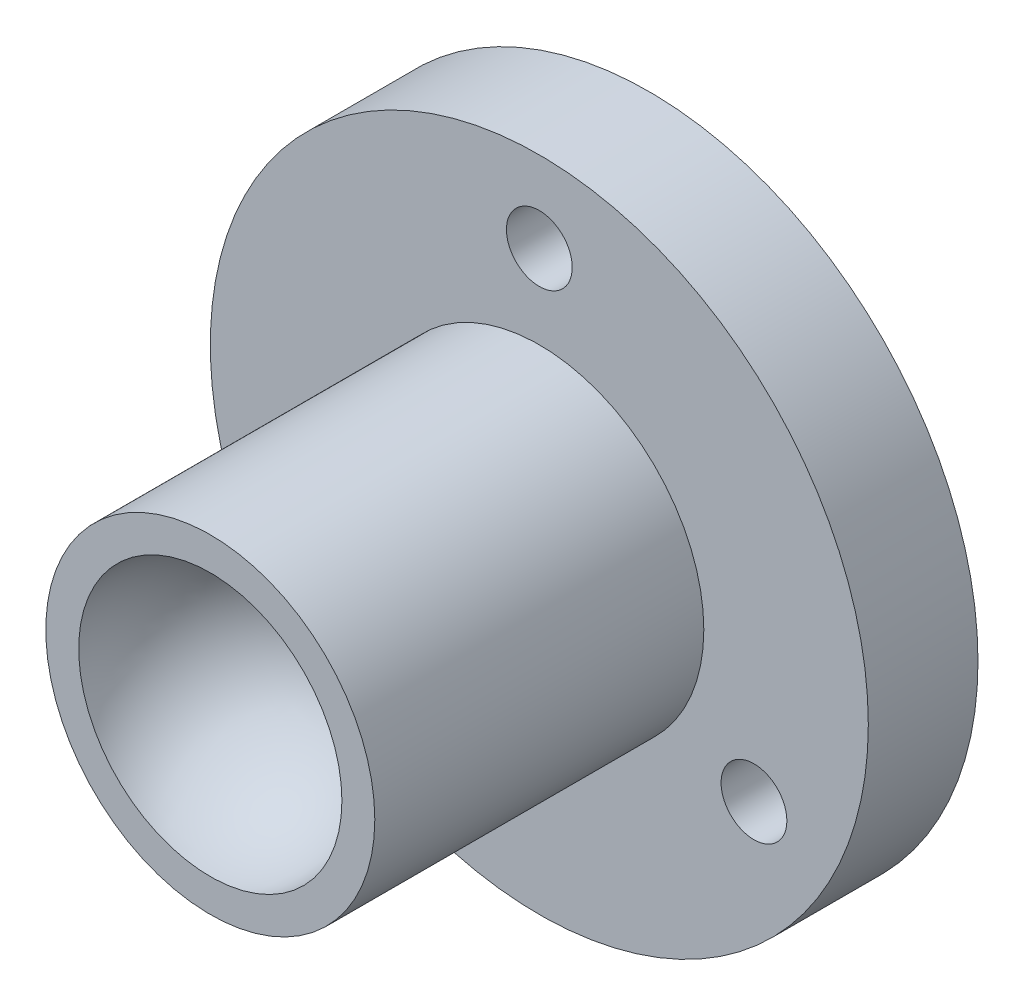
ISO-10303-21;
HEADER;
FILE_DESCRIPTION(('STEP AP214'),'2;1');
FILE_NAME('part.step','',(''),(''),'','','');
FILE_SCHEMA(('AUTOMOTIVE_DESIGN { 1 0 10303 214 1 1 1 1 }'));
ENDSEC;
DATA;
#1=APPLICATION_CONTEXT('core data for automotive mechanical design processes');
#2=APPLICATION_PROTOCOL_DEFINITION('international standard','automotive_design',2000,#1);
#3=PRODUCT_CONTEXT('',#1,'mechanical');
#4=PRODUCT('Part','Part','',(#3));
#5=PRODUCT_RELATED_PRODUCT_CATEGORY('part','',(#4));
#6=PRODUCT_DEFINITION_FORMATION('','',#4);
#7=PRODUCT_DEFINITION_CONTEXT('part definition',#1,'design');
#8=PRODUCT_DEFINITION('design','',#6,#7);
#9=PRODUCT_DEFINITION_SHAPE('','',#8);
#10=(LENGTH_UNIT() NAMED_UNIT(*) SI_UNIT(.MILLI.,.METRE.));
#11=(NAMED_UNIT(*) PLANE_ANGLE_UNIT() SI_UNIT($,.RADIAN.));
#12=(NAMED_UNIT(*) SI_UNIT($,.STERADIAN.) SOLID_ANGLE_UNIT());
#13=UNCERTAINTY_MEASURE_WITH_UNIT(LENGTH_MEASURE(1.E-05),#10,'distance_accuracy_value','');
#14=(GEOMETRIC_REPRESENTATION_CONTEXT(3) GLOBAL_UNCERTAINTY_ASSIGNED_CONTEXT((#13)) GLOBAL_UNIT_ASSIGNED_CONTEXT((#10,
#11,#12)) REPRESENTATION_CONTEXT('',''));
#15=CARTESIAN_POINT('',(0.,0.,0.));
#16=DIRECTION('',(0.,0.,1.));
#17=DIRECTION('',(1.,0.,0.));
#18=AXIS2_PLACEMENT_3D('',#15,#16,#17);
#19=CARTESIAN_POINT('',(0.,0.,15.6202889447236));
#20=DIRECTION('',(0.,0.,-1.));
#21=DIRECTION('',(-1.,0.,0.));
#22=AXIS2_PLACEMENT_3D('',#19,#20,#21);
#23=CYLINDRICAL_SURFACE('',#22,5.15625);
#24=CARTESIAN_POINT('',(0.,0.,5.30778894472364));
#25=DIRECTION('',(0.,0.,1.));
#26=DIRECTION('',(1.,0.,0.));
#27=AXIS2_PLACEMENT_3D('',#24,#25,#26);
#28=CIRCLE('',#27,5.15625);
#29=CARTESIAN_POINT('',(5.15625000000001,0.,5.30778894472364));
#30=VERTEX_POINT('',#29);
#31=EDGE_CURVE('E49',#30,#30,#28,.T.);
#32=ORIENTED_EDGE('',*,*,#31,.T.);
#33=EDGE_LOOP('',(#32));
#34=FACE_BOUND('',#33,.T.);
#35=CARTESIAN_POINT('',(0.,0.,15.6202889447236));
#36=DIRECTION('',(0.,0.,1.));
#37=DIRECTION('',(1.,0.,0.));
#38=AXIS2_PLACEMENT_3D('',#35,#36,#37);
#39=CIRCLE('',#38,5.15625);
#40=CARTESIAN_POINT('',(5.15625000000001,0.,15.6202889447236));
#41=VERTEX_POINT('',#40);
#42=EDGE_CURVE('E10',#41,#41,#39,.T.);
#43=ORIENTED_EDGE('',*,*,#42,.F.);
#44=EDGE_LOOP('',(#43));
#45=FACE_BOUND('',#44,.T.);
#46=ADVANCED_FACE('F37',(#34,#45),#23,.T.);
#47=CARTESIAN_POINT('',(0.,0.,15.6202889447236));
#48=DIRECTION('',(0.,0.,1.));
#49=DIRECTION('',(1.,0.,0.));
#50=AXIS2_PLACEMENT_3D('',#47,#48,#49);
#51=PLANE('',#50);
#52=CARTESIAN_POINT('',(0.,0.,15.6202889447236));
#53=DIRECTION('',(0.,0.,1.));
#54=DIRECTION('',(1.,0.,0.));
#55=AXIS2_PLACEMENT_3D('',#52,#53,#54);
#56=CIRCLE('',#55,4.125);
#57=CARTESIAN_POINT('',(4.12500000000001,0.,15.6202889447236));
#58=VERTEX_POINT('',#57);
#59=EDGE_CURVE('E54',#58,#58,#56,.F.);
#60=ORIENTED_EDGE('',*,*,#59,.T.);
#61=EDGE_LOOP('',(#60));
#62=FACE_BOUND('',#61,.T.);
#63=ORIENTED_EDGE('',*,*,#42,.T.);
#64=EDGE_LOOP('',(#63));
#65=FACE_BOUND('',#64,.T.);
#66=ADVANCED_FACE('F82',(#62,#65),#51,.T.);
#67=CARTESIAN_POINT('',(0.,0.,5.30778894472364));
#68=DIRECTION('',(0.,0.,-1.));
#69=DIRECTION('',(-1.,0.,0.));
#70=AXIS2_PLACEMENT_3D('',#67,#68,#69);
#71=CYLINDRICAL_SURFACE('',#70,10.3125);
#72=CARTESIAN_POINT('',(0.,0.,5.30778894472364));
#73=DIRECTION('',(0.,0.,1.));
#74=DIRECTION('',(1.,0.,0.));
#75=AXIS2_PLACEMENT_3D('',#72,#73,#74);
#76=CIRCLE('',#75,10.3125);
#77=CARTESIAN_POINT('',(10.3125,0.,5.30778894472364));
#78=VERTEX_POINT('',#77);
#79=EDGE_CURVE('E44',#78,#78,#76,.T.);
#80=ORIENTED_EDGE('',*,*,#79,.F.);
#81=EDGE_LOOP('',(#80));
#82=FACE_BOUND('',#81,.T.);
#83=CARTESIAN_POINT('',(0.,0.,1.87028894472364));
#84=DIRECTION('',(0.,0.,1.));
#85=DIRECTION('',(1.,0.,0.));
#86=AXIS2_PLACEMENT_3D('',#83,#84,#85);
#87=CIRCLE('',#86,10.3125);
#88=CARTESIAN_POINT('',(10.3125,0.,1.87028894472364));
#89=VERTEX_POINT('',#88);
#90=EDGE_CURVE('E53',#89,#89,#87,.T.);
#91=ORIENTED_EDGE('',*,*,#90,.T.);
#92=EDGE_LOOP('',(#91));
#93=FACE_BOUND('',#92,.T.);
#94=ADVANCED_FACE('F87',(#82,#93),#71,.T.);
#95=CARTESIAN_POINT('',(0.,0.,5.30778894472364));
#96=DIRECTION('',(0.,0.,1.));
#97=DIRECTION('',(1.,0.,0.));
#98=AXIS2_PLACEMENT_3D('',#95,#96,#97);
#99=PLANE('',#98);
#100=CARTESIAN_POINT('',(0.,7.76875000000004,5.30778894472364));
#101=DIRECTION('',(0.,0.,1.));
#102=DIRECTION('',(1.,0.,0.));
#103=AXIS2_PLACEMENT_3D('',#100,#101,#102);
#104=CIRCLE('',#103,1.03125);
#105=CARTESIAN_POINT('',(1.03125000000001,7.76875000000004,5.30778894472364));
#106=VERTEX_POINT('',#105);
#107=EDGE_CURVE('E60',#106,#106,#104,.T.);
#108=ORIENTED_EDGE('',*,*,#107,.F.);
#109=EDGE_LOOP('',(#108));
#110=FACE_BOUND('',#109,.T.);
#111=CARTESIAN_POINT('',(6.72793485565119,-3.88437499999948,5.30778894472364));
#112=DIRECTION('',(0.,0.,1.));
#113=DIRECTION('',(1.,0.,0.));
#114=AXIS2_PLACEMENT_3D('',#111,#112,#113);
#115=CIRCLE('',#114,1.03125000000069);
#116=CARTESIAN_POINT('',(7.75918485565189,-3.88437499999948,5.30778894472364));
#117=VERTEX_POINT('',#116);
#118=EDGE_CURVE('E100',#117,#117,#115,.T.);
#119=ORIENTED_EDGE('',*,*,#118,.F.);
#120=EDGE_LOOP('',(#119));
#121=FACE_BOUND('',#120,.T.);
#122=CARTESIAN_POINT('',(-6.72793485564953,-3.88437500000044,5.30778894472364));
#123=DIRECTION('',(0.,0.,1.));
#124=DIRECTION('',(1.,0.,0.));
#125=AXIS2_PLACEMENT_3D('',#122,#123,#124);
#126=CIRCLE('',#125,1.031250000001);
#127=CARTESIAN_POINT('',(-5.69668485564853,-3.88437500000044,5.30778894472364));
#128=VERTEX_POINT('',#127);
#129=EDGE_CURVE('E97',#128,#128,#126,.T.);
#130=ORIENTED_EDGE('',*,*,#129,.F.);
#131=EDGE_LOOP('',(#130));
#132=FACE_BOUND('',#131,.T.);
#133=ORIENTED_EDGE('',*,*,#31,.F.);
#134=EDGE_LOOP('',(#133));
#135=FACE_BOUND('',#134,.T.);
#136=ORIENTED_EDGE('',*,*,#79,.T.);
#137=EDGE_LOOP('',(#136));
#138=FACE_BOUND('',#137,.T.);
#139=ADVANCED_FACE('F105',(#110,#121,#132,#135,#138),#99,.T.);
#140=CARTESIAN_POINT('',(0.,0.,1.87028894472364));
#141=DIRECTION('',(0.,0.,1.));
#142=DIRECTION('',(1.,0.,0.));
#143=AXIS2_PLACEMENT_3D('',#140,#141,#142);
#144=PLANE('',#143);
#145=CARTESIAN_POINT('',(0.,7.76875000000004,1.87028894472364));
#146=DIRECTION('',(0.,0.,1.));
#147=DIRECTION('',(1.,0.,0.));
#148=AXIS2_PLACEMENT_3D('',#145,#146,#147);
#149=CIRCLE('',#148,1.03125);
#150=CARTESIAN_POINT('',(1.03125000000001,7.76875000000004,1.87028894472364));
#151=VERTEX_POINT('',#150);
#152=EDGE_CURVE('E40',#151,#151,#149,.T.);
#153=ORIENTED_EDGE('',*,*,#152,.T.);
#154=EDGE_LOOP('',(#153));
#155=FACE_BOUND('',#154,.T.);
#156=CARTESIAN_POINT('',(6.72793485565119,-3.88437499999948,1.87028894472364));
#157=DIRECTION('',(0.,0.,1.));
#158=DIRECTION('',(1.,0.,0.));
#159=AXIS2_PLACEMENT_3D('',#156,#157,#158);
#160=CIRCLE('',#159,1.03125000000069);
#161=CARTESIAN_POINT('',(7.75918485565189,-3.88437499999948,1.87028894472364));
#162=VERTEX_POINT('',#161);
#163=EDGE_CURVE('E59',#162,#162,#160,.T.);
#164=ORIENTED_EDGE('',*,*,#163,.T.);
#165=EDGE_LOOP('',(#164));
#166=FACE_BOUND('',#165,.T.);
#167=CARTESIAN_POINT('',(-6.72793485564953,-3.88437500000044,1.87028894472364));
#168=DIRECTION('',(0.,0.,1.));
#169=DIRECTION('',(1.,0.,0.));
#170=AXIS2_PLACEMENT_3D('',#167,#168,#169);
#171=CIRCLE('',#170,1.031250000001);
#172=CARTESIAN_POINT('',(-5.69668485564853,-3.88437500000044,1.87028894472364));
#173=VERTEX_POINT('',#172);
#174=EDGE_CURVE('E57',#173,#173,#171,.T.);
#175=ORIENTED_EDGE('',*,*,#174,.T.);
#176=EDGE_LOOP('',(#175));
#177=FACE_BOUND('',#176,.T.);
#178=ORIENTED_EDGE('',*,*,#90,.F.);
#179=EDGE_LOOP('',(#178));
#180=FACE_BOUND('',#179,.T.);
#181=ADVANCED_FACE('F67',(#155,#166,#177,#180),#144,.F.);
#182=CARTESIAN_POINT('',(0.,0.,15.6202889447236));
#183=DIRECTION('',(0.,1.,0.));
#184=DIRECTION('',(1.,0.,0.));
#185=AXIS2_PLACEMENT_3D('',#182,#183,#184);
#186=SPHERICAL_SURFACE('',#185,4.125);
#187=CARTESIAN_POINT('',(0.,0.,15.6202889447236));
#188=DIRECTION('',(0.,0.,1.));
#189=DIRECTION('',(1.,0.,0.));
#190=AXIS2_PLACEMENT_3D('',#187,#188,#189);
#191=SPHERICAL_SURFACE('',#190,4.125);
#192=ORIENTED_EDGE('',*,*,#59,.F.);
#193=EDGE_LOOP('',(#192));
#194=FACE_BOUND('',#193,.T.);
#195=ADVANCED_FACE('F121',(#194),#191,.F.);
#196=CARTESIAN_POINT('',(-6.72793485564953,-3.88437500000044,-2.25471105527636));
#197=DIRECTION('',(0.,0.,1.));
#198=DIRECTION('',(1.,0.,0.));
#199=AXIS2_PLACEMENT_3D('',#196,#197,#198);
#200=CYLINDRICAL_SURFACE('',#199,1.031250000001);
#201=ORIENTED_EDGE('',*,*,#129,.T.);
#202=EDGE_LOOP('',(#201));
#203=FACE_BOUND('',#202,.T.);
#204=ORIENTED_EDGE('',*,*,#174,.F.);
#205=EDGE_LOOP('',(#204));
#206=FACE_BOUND('',#205,.T.);
#207=ADVANCED_FACE('F77',(#203,#206),#200,.F.);
#208=CARTESIAN_POINT('',(6.72793485565119,-3.88437499999948,-2.25471105527636));
#209=DIRECTION('',(0.,0.,1.));
#210=DIRECTION('',(1.,0.,0.));
#211=AXIS2_PLACEMENT_3D('',#208,#209,#210);
#212=CYLINDRICAL_SURFACE('',#211,1.03125000000069);
#213=ORIENTED_EDGE('',*,*,#118,.T.);
#214=EDGE_LOOP('',(#213));
#215=FACE_BOUND('',#214,.T.);
#216=ORIENTED_EDGE('',*,*,#163,.F.);
#217=EDGE_LOOP('',(#216));
#218=FACE_BOUND('',#217,.T.);
#219=ADVANCED_FACE('F71',(#215,#218),#212,.F.);
#220=CARTESIAN_POINT('',(0.,7.76875000000004,-2.25471105527636));
#221=DIRECTION('',(0.,0.,1.));
#222=DIRECTION('',(1.,0.,0.));
#223=AXIS2_PLACEMENT_3D('',#220,#221,#222);
#224=CYLINDRICAL_SURFACE('',#223,1.03125);
#225=ORIENTED_EDGE('',*,*,#107,.T.);
#226=EDGE_LOOP('',(#225));
#227=FACE_BOUND('',#226,.T.);
#228=ORIENTED_EDGE('',*,*,#152,.F.);
#229=EDGE_LOOP('',(#228));
#230=FACE_BOUND('',#229,.T.);
#231=ADVANCED_FACE('F69',(#227,#230),#224,.F.);
#232=CLOSED_SHELL('',(#46,#66,#94,#139,#181,#195,#207,#219,#231));
#233=MANIFOLD_SOLID_BREP('B2',#232);
#234=ADVANCED_BREP_SHAPE_REPRESENTATION('',(#18,#233),#14);
#235=SHAPE_DEFINITION_REPRESENTATION(#9,#234);
ENDSEC;
END-ISO-10303-21;
